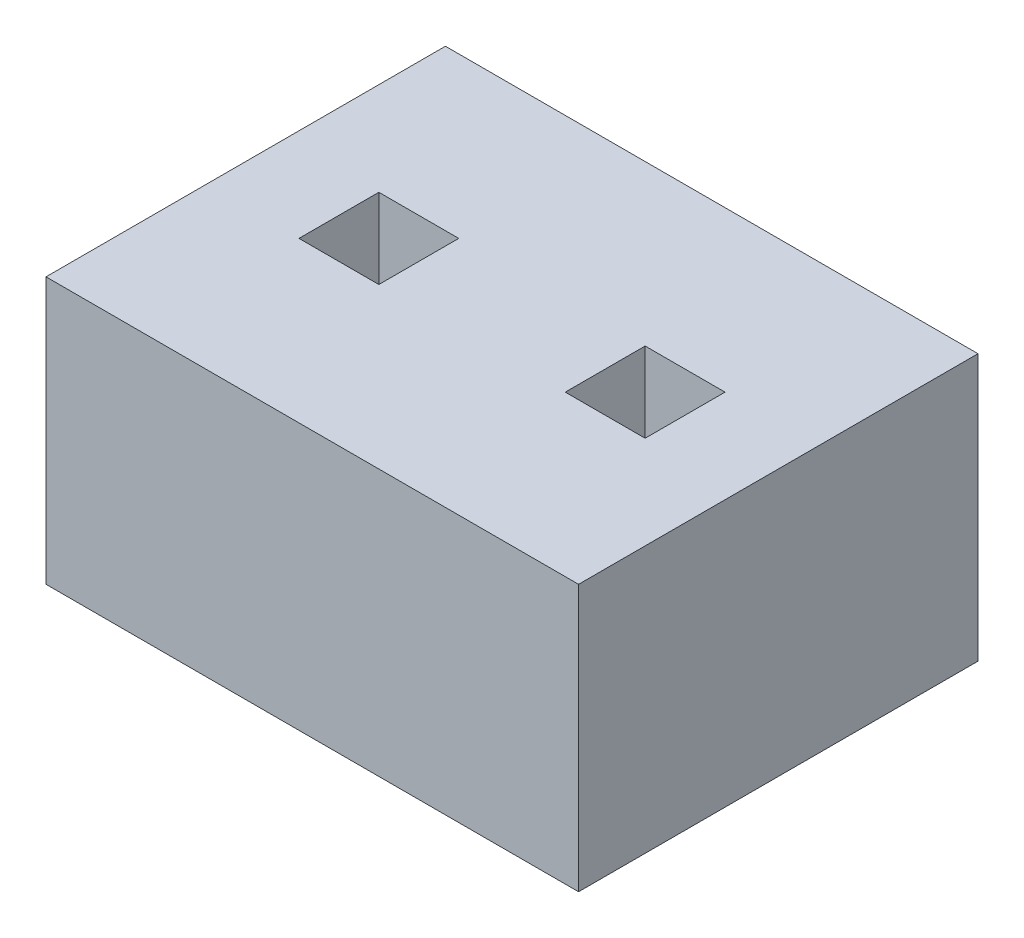
ISO-10303-21;
HEADER;
FILE_DESCRIPTION(('STEP AP214'),'2;1');
FILE_NAME('part.step','',(''),(''),'','','');
FILE_SCHEMA(('AUTOMOTIVE_DESIGN { 1 0 10303 214 1 1 1 1 }'));
ENDSEC;
DATA;
#1=APPLICATION_CONTEXT('core data for automotive mechanical design processes');
#2=APPLICATION_PROTOCOL_DEFINITION('international standard','automotive_design',2000,#1);
#3=PRODUCT_CONTEXT('',#1,'mechanical');
#4=PRODUCT('Part','Part','',(#3));
#5=PRODUCT_RELATED_PRODUCT_CATEGORY('part','',(#4));
#6=PRODUCT_DEFINITION_FORMATION('','',#4);
#7=PRODUCT_DEFINITION_CONTEXT('part definition',#1,'design');
#8=PRODUCT_DEFINITION('design','',#6,#7);
#9=PRODUCT_DEFINITION_SHAPE('','',#8);
#10=(LENGTH_UNIT() NAMED_UNIT(*) SI_UNIT(.MILLI.,.METRE.));
#11=(NAMED_UNIT(*) PLANE_ANGLE_UNIT() SI_UNIT($,.RADIAN.));
#12=(NAMED_UNIT(*) SI_UNIT($,.STERADIAN.) SOLID_ANGLE_UNIT());
#13=UNCERTAINTY_MEASURE_WITH_UNIT(LENGTH_MEASURE(1.E-05),#10,'distance_accuracy_value','');
#14=(GEOMETRIC_REPRESENTATION_CONTEXT(3) GLOBAL_UNCERTAINTY_ASSIGNED_CONTEXT((#13)) GLOBAL_UNIT_ASSIGNED_CONTEXT((#10,
#11,#12)) REPRESENTATION_CONTEXT('',''));
#15=CARTESIAN_POINT('',(0.,0.,0.));
#16=DIRECTION('',(0.,0.,1.));
#17=DIRECTION('',(1.,0.,0.));
#18=AXIS2_PLACEMENT_3D('',#15,#16,#17);
#19=CARTESIAN_POINT('',(0.,1.,0.));
#20=DIRECTION('',(1.,0.,0.));
#21=DIRECTION('',(0.,0.,-1.));
#22=AXIS2_PLACEMENT_3D('',#19,#20,#21);
#23=PLANE('',#22);
#24=DIRECTION('',(0.,0.,1.));
#25=VECTOR('',#24,1.);
#26=CARTESIAN_POINT('',(0.,0.,0.));
#27=LINE('',#26,#25);
#28=CARTESIAN_POINT('',(0.,0.,0.));
#29=VERTEX_POINT('',#28);
#30=CARTESIAN_POINT('',(0.,0.,1.5));
#31=VERTEX_POINT('',#30);
#32=EDGE_CURVE('E11',#29,#31,#27,.T.);
#33=ORIENTED_EDGE('',*,*,#32,.T.);
#34=DIRECTION('',(0.,-1.,0.));
#35=VECTOR('',#34,1.);
#36=CARTESIAN_POINT('',(0.,1.,1.5));
#37=LINE('',#36,#35);
#38=CARTESIAN_POINT('',(0.,1.,1.5));
#39=VERTEX_POINT('',#38);
#40=EDGE_CURVE('E25',#39,#31,#37,.T.);
#41=ORIENTED_EDGE('',*,*,#40,.F.);
#42=DIRECTION('',(0.,0.,1.));
#43=VECTOR('',#42,1.);
#44=CARTESIAN_POINT('',(0.,1.,0.));
#45=LINE('',#44,#43);
#46=CARTESIAN_POINT('',(0.,1.,0.));
#47=VERTEX_POINT('',#46);
#48=EDGE_CURVE('E249',#47,#39,#45,.T.);
#49=ORIENTED_EDGE('',*,*,#48,.F.);
#50=DIRECTION('',(0.,-1.,0.));
#51=VECTOR('',#50,1.);
#52=CARTESIAN_POINT('',(0.,1.,0.));
#53=LINE('',#52,#51);
#54=EDGE_CURVE('E245',#47,#29,#53,.T.);
#55=ORIENTED_EDGE('',*,*,#54,.T.);
#56=EDGE_LOOP('',(#33,#41,#49,#55));
#57=FACE_BOUND('',#56,.T.);
#58=ADVANCED_FACE('F17',(#57),#23,.F.);
#59=CARTESIAN_POINT('',(2.,1.,0.));
#60=DIRECTION('',(0.,0.,1.));
#61=DIRECTION('',(1.,0.,0.));
#62=AXIS2_PLACEMENT_3D('',#59,#60,#61);
#63=PLANE('',#62);
#64=DIRECTION('',(-1.,0.,0.));
#65=VECTOR('',#64,1.);
#66=CARTESIAN_POINT('',(2.,0.,0.));
#67=LINE('',#66,#65);
#68=CARTESIAN_POINT('',(2.,0.,0.));
#69=VERTEX_POINT('',#68);
#70=EDGE_CURVE('E240',#69,#29,#67,.T.);
#71=ORIENTED_EDGE('',*,*,#70,.T.);
#72=ORIENTED_EDGE('',*,*,#54,.F.);
#73=DIRECTION('',(-1.,0.,0.));
#74=VECTOR('',#73,1.);
#75=CARTESIAN_POINT('',(2.,1.,0.));
#76=LINE('',#75,#74);
#77=CARTESIAN_POINT('',(2.,1.,0.));
#78=VERTEX_POINT('',#77);
#79=EDGE_CURVE('E235',#78,#47,#76,.T.);
#80=ORIENTED_EDGE('',*,*,#79,.F.);
#81=DIRECTION('',(0.,-1.,0.));
#82=VECTOR('',#81,1.);
#83=CARTESIAN_POINT('',(2.,1.,0.));
#84=LINE('',#83,#82);
#85=EDGE_CURVE('E231',#78,#69,#84,.T.);
#86=ORIENTED_EDGE('',*,*,#85,.T.);
#87=EDGE_LOOP('',(#71,#72,#80,#86));
#88=FACE_BOUND('',#87,.T.);
#89=ADVANCED_FACE('F267',(#88),#63,.F.);
#90=CARTESIAN_POINT('',(2.,1.,1.5));
#91=DIRECTION('',(-1.,0.,0.));
#92=DIRECTION('',(0.,0.,1.));
#93=AXIS2_PLACEMENT_3D('',#90,#91,#92);
#94=PLANE('',#93);
#95=DIRECTION('',(0.,0.,-1.));
#96=VECTOR('',#95,1.);
#97=CARTESIAN_POINT('',(2.,0.,1.5));
#98=LINE('',#97,#96);
#99=CARTESIAN_POINT('',(2.,0.,1.5));
#100=VERTEX_POINT('',#99);
#101=EDGE_CURVE('E226',#100,#69,#98,.T.);
#102=ORIENTED_EDGE('',*,*,#101,.T.);
#103=ORIENTED_EDGE('',*,*,#85,.F.);
#104=DIRECTION('',(0.,0.,-1.));
#105=VECTOR('',#104,1.);
#106=CARTESIAN_POINT('',(2.,1.,1.5));
#107=LINE('',#106,#105);
#108=CARTESIAN_POINT('',(2.,1.,1.5));
#109=VERTEX_POINT('',#108);
#110=EDGE_CURVE('E221',#109,#78,#107,.T.);
#111=ORIENTED_EDGE('',*,*,#110,.F.);
#112=DIRECTION('',(0.,-1.,0.));
#113=VECTOR('',#112,1.);
#114=CARTESIAN_POINT('',(2.,1.,1.5));
#115=LINE('',#114,#113);
#116=EDGE_CURVE('E217',#109,#100,#115,.T.);
#117=ORIENTED_EDGE('',*,*,#116,.T.);
#118=EDGE_LOOP('',(#102,#103,#111,#117));
#119=FACE_BOUND('',#118,.T.);
#120=ADVANCED_FACE('F271',(#119),#94,.F.);
#121=CARTESIAN_POINT('',(0.,1.,1.5));
#122=DIRECTION('',(0.,0.,-1.));
#123=DIRECTION('',(-1.,0.,0.));
#124=AXIS2_PLACEMENT_3D('',#121,#122,#123);
#125=PLANE('',#124);
#126=DIRECTION('',(1.,0.,0.));
#127=VECTOR('',#126,1.);
#128=CARTESIAN_POINT('',(0.,0.,1.5));
#129=LINE('',#128,#127);
#130=EDGE_CURVE('E212',#31,#100,#129,.T.);
#131=ORIENTED_EDGE('',*,*,#130,.T.);
#132=ORIENTED_EDGE('',*,*,#116,.F.);
#133=DIRECTION('',(1.,0.,0.));
#134=VECTOR('',#133,1.);
#135=CARTESIAN_POINT('',(0.,1.,1.5));
#136=LINE('',#135,#134);
#137=EDGE_CURVE('E207',#39,#109,#136,.T.);
#138=ORIENTED_EDGE('',*,*,#137,.F.);
#139=ORIENTED_EDGE('',*,*,#40,.T.);
#140=EDGE_LOOP('',(#131,#132,#138,#139));
#141=FACE_BOUND('',#140,.T.);
#142=ADVANCED_FACE('F259',(#141),#125,.F.);
#143=CARTESIAN_POINT('',(0.,1.,0.));
#144=DIRECTION('',(0.,1.,0.));
#145=DIRECTION('',(0.,0.,1.));
#146=AXIS2_PLACEMENT_3D('',#143,#144,#145);
#147=PLANE('',#146);
#148=DIRECTION('',(0.,0.,1.));
#149=VECTOR('',#148,1.);
#150=CARTESIAN_POINT('',(0.35,1.,0.6));
#151=LINE('',#150,#149);
#152=CARTESIAN_POINT('',(0.35,1.,0.6));
#153=VERTEX_POINT('',#152);
#154=CARTESIAN_POINT('',(0.35,1.,0.9));
#155=VERTEX_POINT('',#154);
#156=EDGE_CURVE('E203',#153,#155,#151,.T.);
#157=ORIENTED_EDGE('',*,*,#156,.F.);
#158=DIRECTION('',(-1.,0.,0.));
#159=VECTOR('',#158,1.);
#160=CARTESIAN_POINT('',(0.65,1.,0.6));
#161=LINE('',#160,#159);
#162=CARTESIAN_POINT('',(0.65,1.,0.6));
#163=VERTEX_POINT('',#162);
#164=EDGE_CURVE('E119',#163,#153,#161,.T.);
#165=ORIENTED_EDGE('',*,*,#164,.F.);
#166=DIRECTION('',(0.,0.,-1.));
#167=VECTOR('',#166,1.);
#168=CARTESIAN_POINT('',(0.65,1.,0.9));
#169=LINE('',#168,#167);
#170=CARTESIAN_POINT('',(0.65,1.,0.9));
#171=VERTEX_POINT('',#170);
#172=EDGE_CURVE('E195',#171,#163,#169,.T.);
#173=ORIENTED_EDGE('',*,*,#172,.F.);
#174=DIRECTION('',(1.,0.,0.));
#175=VECTOR('',#174,1.);
#176=CARTESIAN_POINT('',(0.35,1.,0.9));
#177=LINE('',#176,#175);
#178=EDGE_CURVE('E190',#155,#171,#177,.T.);
#179=ORIENTED_EDGE('',*,*,#178,.F.);
#180=EDGE_LOOP('',(#157,#165,#173,#179));
#181=FACE_BOUND('',#180,.T.);
#182=DIRECTION('',(0.,0.,1.));
#183=VECTOR('',#182,1.);
#184=CARTESIAN_POINT('',(1.35,1.,0.6));
#185=LINE('',#184,#183);
#186=CARTESIAN_POINT('',(1.35,1.,0.6));
#187=VERTEX_POINT('',#186);
#188=CARTESIAN_POINT('',(1.35,1.,0.9));
#189=VERTEX_POINT('',#188);
#190=EDGE_CURVE('E185',#187,#189,#185,.T.);
#191=ORIENTED_EDGE('',*,*,#190,.F.);
#192=DIRECTION('',(-1.,0.,0.));
#193=VECTOR('',#192,1.);
#194=CARTESIAN_POINT('',(1.65,1.,0.6));
#195=LINE('',#194,#193);
#196=CARTESIAN_POINT('',(1.65,1.,0.6));
#197=VERTEX_POINT('',#196);
#198=EDGE_CURVE('E180',#197,#187,#195,.T.);
#199=ORIENTED_EDGE('',*,*,#198,.F.);
#200=DIRECTION('',(0.,0.,-1.));
#201=VECTOR('',#200,1.);
#202=CARTESIAN_POINT('',(1.65,1.,0.9));
#203=LINE('',#202,#201);
#204=CARTESIAN_POINT('',(1.65,1.,0.9));
#205=VERTEX_POINT('',#204);
#206=EDGE_CURVE('E175',#205,#197,#203,.T.);
#207=ORIENTED_EDGE('',*,*,#206,.F.);
#208=DIRECTION('',(1.,0.,0.));
#209=VECTOR('',#208,1.);
#210=CARTESIAN_POINT('',(1.35,1.,0.9));
#211=LINE('',#210,#209);
#212=EDGE_CURVE('E170',#189,#205,#211,.T.);
#213=ORIENTED_EDGE('',*,*,#212,.F.);
#214=EDGE_LOOP('',(#191,#199,#207,#213));
#215=FACE_BOUND('',#214,.T.);
#216=ORIENTED_EDGE('',*,*,#48,.T.);
#217=ORIENTED_EDGE('',*,*,#137,.T.);
#218=ORIENTED_EDGE('',*,*,#110,.T.);
#219=ORIENTED_EDGE('',*,*,#79,.T.);
#220=EDGE_LOOP('',(#216,#217,#218,#219));
#221=FACE_BOUND('',#220,.T.);
#222=ADVANCED_FACE('F263',(#181,#215,#221),#147,.T.);
#223=CARTESIAN_POINT('',(1.35,1.,0.9));
#224=DIRECTION('',(0.,0.,-1.));
#225=DIRECTION('',(-1.,0.,0.));
#226=AXIS2_PLACEMENT_3D('',#223,#224,#225);
#227=PLANE('',#226);
#228=DIRECTION('',(1.,0.,0.));
#229=VECTOR('',#228,1.);
#230=CARTESIAN_POINT('',(1.35,0.,0.9));
#231=LINE('',#230,#229);
#232=CARTESIAN_POINT('',(1.35,0.,0.9));
#233=VERTEX_POINT('',#232);
#234=CARTESIAN_POINT('',(1.65,0.,0.9));
#235=VERTEX_POINT('',#234);
#236=EDGE_CURVE('E165',#233,#235,#231,.T.);
#237=ORIENTED_EDGE('',*,*,#236,.F.);
#238=DIRECTION('',(0.,-1.,0.));
#239=VECTOR('',#238,1.);
#240=CARTESIAN_POINT('',(1.35,1.,0.9));
#241=LINE('',#240,#239);
#242=EDGE_CURVE('E160',#189,#233,#241,.T.);
#243=ORIENTED_EDGE('',*,*,#242,.F.);
#244=ORIENTED_EDGE('',*,*,#212,.T.);
#245=DIRECTION('',(0.,-1.,0.));
#246=VECTOR('',#245,1.);
#247=CARTESIAN_POINT('',(1.65,1.,0.9));
#248=LINE('',#247,#246);
#249=EDGE_CURVE('E156',#205,#235,#248,.T.);
#250=ORIENTED_EDGE('',*,*,#249,.T.);
#251=EDGE_LOOP('',(#237,#243,#244,#250));
#252=FACE_BOUND('',#251,.T.);
#253=ADVANCED_FACE('F314',(#252),#227,.T.);
#254=CARTESIAN_POINT('',(1.65,1.,0.9));
#255=DIRECTION('',(-1.,0.,0.));
#256=DIRECTION('',(0.,0.,1.));
#257=AXIS2_PLACEMENT_3D('',#254,#255,#256);
#258=PLANE('',#257);
#259=DIRECTION('',(0.,0.,-1.));
#260=VECTOR('',#259,1.);
#261=CARTESIAN_POINT('',(1.65,0.,0.9));
#262=LINE('',#261,#260);
#263=CARTESIAN_POINT('',(1.65,0.,0.6));
#264=VERTEX_POINT('',#263);
#265=EDGE_CURVE('E151',#235,#264,#262,.T.);
#266=ORIENTED_EDGE('',*,*,#265,.F.);
#267=ORIENTED_EDGE('',*,*,#249,.F.);
#268=ORIENTED_EDGE('',*,*,#206,.T.);
#269=DIRECTION('',(0.,-1.,0.));
#270=VECTOR('',#269,1.);
#271=CARTESIAN_POINT('',(1.65,1.,0.6));
#272=LINE('',#271,#270);
#273=EDGE_CURVE('E147',#197,#264,#272,.T.);
#274=ORIENTED_EDGE('',*,*,#273,.T.);
#275=EDGE_LOOP('',(#266,#267,#268,#274));
#276=FACE_BOUND('',#275,.T.);
#277=ADVANCED_FACE('F325',(#276),#258,.T.);
#278=CARTESIAN_POINT('',(1.65,1.,0.6));
#279=DIRECTION('',(0.,0.,1.));
#280=DIRECTION('',(1.,0.,0.));
#281=AXIS2_PLACEMENT_3D('',#278,#279,#280);
#282=PLANE('',#281);
#283=DIRECTION('',(-1.,0.,0.));
#284=VECTOR('',#283,1.);
#285=CARTESIAN_POINT('',(1.65,0.,0.6));
#286=LINE('',#285,#284);
#287=CARTESIAN_POINT('',(1.35,0.,0.6));
#288=VERTEX_POINT('',#287);
#289=EDGE_CURVE('E142',#264,#288,#286,.T.);
#290=ORIENTED_EDGE('',*,*,#289,.F.);
#291=ORIENTED_EDGE('',*,*,#273,.F.);
#292=ORIENTED_EDGE('',*,*,#198,.T.);
#293=DIRECTION('',(0.,-1.,0.));
#294=VECTOR('',#293,1.);
#295=CARTESIAN_POINT('',(1.35,1.,0.6));
#296=LINE('',#295,#294);
#297=EDGE_CURVE('E131',#187,#288,#296,.T.);
#298=ORIENTED_EDGE('',*,*,#297,.T.);
#299=EDGE_LOOP('',(#290,#291,#292,#298));
#300=FACE_BOUND('',#299,.T.);
#301=ADVANCED_FACE('F336',(#300),#282,.T.);
#302=CARTESIAN_POINT('',(1.35,1.,0.6));
#303=DIRECTION('',(1.,0.,0.));
#304=DIRECTION('',(0.,0.,-1.));
#305=AXIS2_PLACEMENT_3D('',#302,#303,#304);
#306=PLANE('',#305);
#307=DIRECTION('',(0.,0.,1.));
#308=VECTOR('',#307,1.);
#309=CARTESIAN_POINT('',(1.35,0.,0.6));
#310=LINE('',#309,#308);
#311=EDGE_CURVE('E127',#288,#233,#310,.T.);
#312=ORIENTED_EDGE('',*,*,#311,.F.);
#313=ORIENTED_EDGE('',*,*,#297,.F.);
#314=ORIENTED_EDGE('',*,*,#190,.T.);
#315=ORIENTED_EDGE('',*,*,#242,.T.);
#316=EDGE_LOOP('',(#312,#313,#314,#315));
#317=FACE_BOUND('',#316,.T.);
#318=ADVANCED_FACE('F347',(#317),#306,.T.);
#319=CARTESIAN_POINT('',(0.,0.,0.));
#320=DIRECTION('',(0.,1.,0.));
#321=DIRECTION('',(0.,0.,1.));
#322=AXIS2_PLACEMENT_3D('',#319,#320,#321);
#323=PLANE('',#322);
#324=DIRECTION('',(0.,0.,1.));
#325=VECTOR('',#324,1.);
#326=CARTESIAN_POINT('',(0.35,0.,0.6));
#327=LINE('',#326,#325);
#328=CARTESIAN_POINT('',(0.35,0.,0.6));
#329=VERTEX_POINT('',#328);
#330=CARTESIAN_POINT('',(0.35,0.,0.9));
#331=VERTEX_POINT('',#330);
#332=EDGE_CURVE('E106',#329,#331,#327,.T.);
#333=ORIENTED_EDGE('',*,*,#332,.T.);
#334=DIRECTION('',(1.,0.,0.));
#335=VECTOR('',#334,1.);
#336=CARTESIAN_POINT('',(0.35,0.,0.9));
#337=LINE('',#336,#335);
#338=CARTESIAN_POINT('',(0.65,0.,0.9));
#339=VERTEX_POINT('',#338);
#340=EDGE_CURVE('E128',#331,#339,#337,.T.);
#341=ORIENTED_EDGE('',*,*,#340,.T.);
#342=DIRECTION('',(0.,0.,-1.));
#343=VECTOR('',#342,1.);
#344=CARTESIAN_POINT('',(0.65,0.,0.9));
#345=LINE('',#344,#343);
#346=CARTESIAN_POINT('',(0.65,0.,0.6));
#347=VERTEX_POINT('',#346);
#348=EDGE_CURVE('E109',#339,#347,#345,.T.);
#349=ORIENTED_EDGE('',*,*,#348,.T.);
#350=DIRECTION('',(-1.,0.,0.));
#351=VECTOR('',#350,1.);
#352=CARTESIAN_POINT('',(0.65,0.,0.6));
#353=LINE('',#352,#351);
#354=EDGE_CURVE('E101',#347,#329,#353,.T.);
#355=ORIENTED_EDGE('',*,*,#354,.T.);
#356=EDGE_LOOP('',(#333,#341,#349,#355));
#357=FACE_BOUND('',#356,.T.);
#358=ORIENTED_EDGE('',*,*,#311,.T.);
#359=ORIENTED_EDGE('',*,*,#236,.T.);
#360=ORIENTED_EDGE('',*,*,#265,.T.);
#361=ORIENTED_EDGE('',*,*,#289,.T.);
#362=EDGE_LOOP('',(#358,#359,#360,#361));
#363=FACE_BOUND('',#362,.T.);
#364=ORIENTED_EDGE('',*,*,#32,.F.);
#365=ORIENTED_EDGE('',*,*,#70,.F.);
#366=ORIENTED_EDGE('',*,*,#101,.F.);
#367=ORIENTED_EDGE('',*,*,#130,.F.);
#368=EDGE_LOOP('',(#364,#365,#366,#367));
#369=FACE_BOUND('',#368,.T.);
#370=ADVANCED_FACE('F103',(#357,#363,#369),#323,.F.);
#371=CARTESIAN_POINT('',(0.65,1.,0.6));
#372=DIRECTION('',(0.,0.,1.));
#373=DIRECTION('',(1.,0.,0.));
#374=AXIS2_PLACEMENT_3D('',#371,#372,#373);
#375=PLANE('',#374);
#376=ORIENTED_EDGE('',*,*,#354,.F.);
#377=DIRECTION('',(0.,-1.,0.));
#378=VECTOR('',#377,1.);
#379=CARTESIAN_POINT('',(0.65,1.,0.6));
#380=LINE('',#379,#378);
#381=EDGE_CURVE('E113',#163,#347,#380,.T.);
#382=ORIENTED_EDGE('',*,*,#381,.F.);
#383=ORIENTED_EDGE('',*,*,#164,.T.);
#384=DIRECTION('',(0.,-1.,0.));
#385=VECTOR('',#384,1.);
#386=CARTESIAN_POINT('',(0.35,1.,0.6));
#387=LINE('',#386,#385);
#388=EDGE_CURVE('E117',#153,#329,#387,.T.);
#389=ORIENTED_EDGE('',*,*,#388,.T.);
#390=EDGE_LOOP('',(#376,#382,#383,#389));
#391=FACE_BOUND('',#390,.T.);
#392=ADVANCED_FACE('F118',(#391),#375,.T.);
#393=CARTESIAN_POINT('',(0.35,1.,0.6));
#394=DIRECTION('',(1.,0.,0.));
#395=DIRECTION('',(0.,0.,-1.));
#396=AXIS2_PLACEMENT_3D('',#393,#394,#395);
#397=PLANE('',#396);
#398=ORIENTED_EDGE('',*,*,#332,.F.);
#399=ORIENTED_EDGE('',*,*,#388,.F.);
#400=ORIENTED_EDGE('',*,*,#156,.T.);
#401=DIRECTION('',(0.,-1.,0.));
#402=VECTOR('',#401,1.);
#403=CARTESIAN_POINT('',(0.35,1.,0.9));
#404=LINE('',#403,#402);
#405=EDGE_CURVE('E122',#155,#331,#404,.T.);
#406=ORIENTED_EDGE('',*,*,#405,.T.);
#407=EDGE_LOOP('',(#398,#399,#400,#406));
#408=FACE_BOUND('',#407,.T.);
#409=ADVANCED_FACE('F124',(#408),#397,.T.);
#410=CARTESIAN_POINT('',(0.35,1.,0.9));
#411=DIRECTION('',(0.,0.,-1.));
#412=DIRECTION('',(-1.,0.,0.));
#413=AXIS2_PLACEMENT_3D('',#410,#411,#412);
#414=PLANE('',#413);
#415=ORIENTED_EDGE('',*,*,#340,.F.);
#416=ORIENTED_EDGE('',*,*,#405,.F.);
#417=ORIENTED_EDGE('',*,*,#178,.T.);
#418=DIRECTION('',(0.,-1.,0.));
#419=VECTOR('',#418,1.);
#420=CARTESIAN_POINT('',(0.65,1.,0.9));
#421=LINE('',#420,#419);
#422=EDGE_CURVE('E435',#171,#339,#421,.T.);
#423=ORIENTED_EDGE('',*,*,#422,.T.);
#424=EDGE_LOOP('',(#415,#416,#417,#423));
#425=FACE_BOUND('',#424,.T.);
#426=ADVANCED_FACE('F386',(#425),#414,.T.);
#427=CARTESIAN_POINT('',(0.65,1.,0.9));
#428=DIRECTION('',(-1.,0.,0.));
#429=DIRECTION('',(0.,0.,1.));
#430=AXIS2_PLACEMENT_3D('',#427,#428,#429);
#431=PLANE('',#430);
#432=ORIENTED_EDGE('',*,*,#348,.F.);
#433=ORIENTED_EDGE('',*,*,#422,.F.);
#434=ORIENTED_EDGE('',*,*,#172,.T.);
#435=ORIENTED_EDGE('',*,*,#381,.T.);
#436=EDGE_LOOP('',(#432,#433,#434,#435));
#437=FACE_BOUND('',#436,.T.);
#438=ADVANCED_FACE('F396',(#437),#431,.T.);
#439=CLOSED_SHELL('',(#58,#89,#120,#142,#222,#253,#277,#301,#318,#370,#392,#409,#426,#438));
#440=MANIFOLD_SOLID_BREP('B1',#439);
#441=ADVANCED_BREP_SHAPE_REPRESENTATION('',(#18,#440),#14);
#442=SHAPE_DEFINITION_REPRESENTATION(#9,#441);
ENDSEC;
END-ISO-10303-21;
